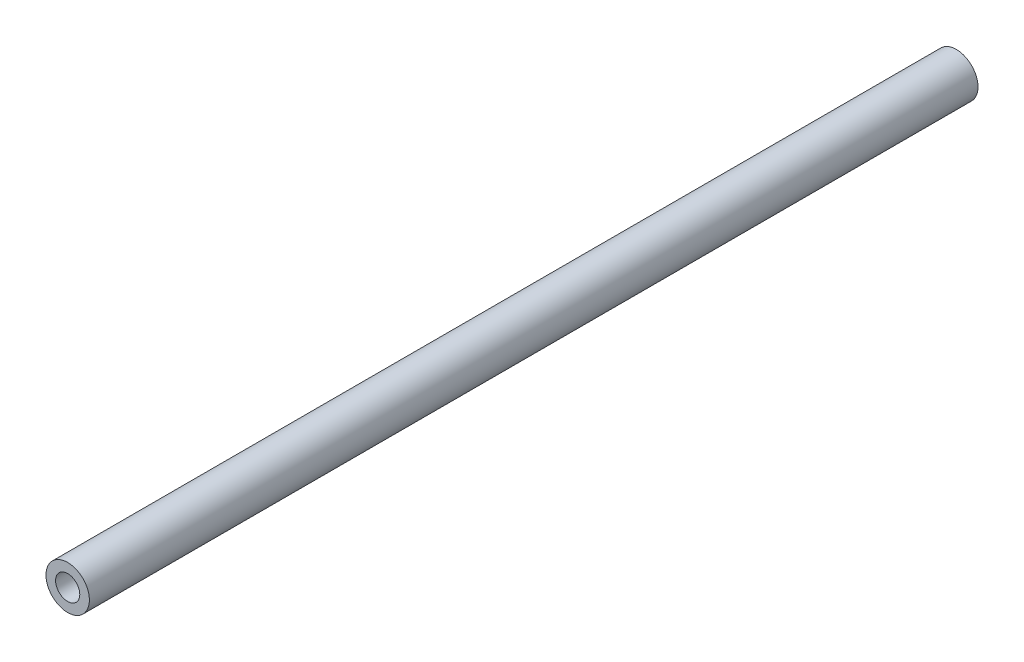
ISO-10303-21;
HEADER;
FILE_DESCRIPTION(('STEP AP214'),'2;1');
FILE_NAME('part.step','',(''),(''),'','','');
FILE_SCHEMA(('AUTOMOTIVE_DESIGN { 1 0 10303 214 1 1 1 1 }'));
ENDSEC;
DATA;
#1=APPLICATION_CONTEXT('core data for automotive mechanical design processes');
#2=APPLICATION_PROTOCOL_DEFINITION('international standard','automotive_design',2000,#1);
#3=PRODUCT_CONTEXT('',#1,'mechanical');
#4=PRODUCT('Part','Part','',(#3));
#5=PRODUCT_RELATED_PRODUCT_CATEGORY('part','',(#4));
#6=PRODUCT_DEFINITION_FORMATION('','',#4);
#7=PRODUCT_DEFINITION_CONTEXT('part definition',#1,'design');
#8=PRODUCT_DEFINITION('design','',#6,#7);
#9=PRODUCT_DEFINITION_SHAPE('','',#8);
#10=(LENGTH_UNIT() NAMED_UNIT(*) SI_UNIT(.MILLI.,.METRE.));
#11=(NAMED_UNIT(*) PLANE_ANGLE_UNIT() SI_UNIT($,.RADIAN.));
#12=(NAMED_UNIT(*) SI_UNIT($,.STERADIAN.) SOLID_ANGLE_UNIT());
#13=UNCERTAINTY_MEASURE_WITH_UNIT(LENGTH_MEASURE(1.E-05),#10,'distance_accuracy_value','');
#14=(GEOMETRIC_REPRESENTATION_CONTEXT(3) GLOBAL_UNCERTAINTY_ASSIGNED_CONTEXT((#13)) GLOBAL_UNIT_ASSIGNED_CONTEXT((#10,
#11,#12)) REPRESENTATION_CONTEXT('',''));
#15=CARTESIAN_POINT('',(0.,0.,0.));
#16=DIRECTION('',(0.,0.,1.));
#17=DIRECTION('',(1.,0.,0.));
#18=AXIS2_PLACEMENT_3D('',#15,#16,#17);
#19=CARTESIAN_POINT('',(0.,0.,350.));
#20=DIRECTION('',(0.,0.,1.));
#21=DIRECTION('',(1.,0.,0.));
#22=AXIS2_PLACEMENT_3D('',#19,#20,#21);
#23=PLANE('',#22);
#24=CARTESIAN_POINT('',(0.,0.,350.));
#25=DIRECTION('',(0.,0.,1.));
#26=DIRECTION('',(1.,0.,0.));
#27=AXIS2_PLACEMENT_3D('',#24,#25,#26);
#28=CIRCLE('',#27,8.55);
#29=CARTESIAN_POINT('',(8.55,0.,350.));
#30=VERTEX_POINT('',#29);
#31=EDGE_CURVE('E10',#30,#30,#28,.T.);
#32=ORIENTED_EDGE('',*,*,#31,.T.);
#33=EDGE_LOOP('',(#32));
#34=FACE_BOUND('',#33,.T.);
#35=CARTESIAN_POINT('',(0.,0.,350.));
#36=DIRECTION('',(0.,0.,1.));
#37=DIRECTION('',(1.,0.,0.));
#38=AXIS2_PLACEMENT_3D('',#35,#36,#37);
#39=CIRCLE('',#38,4.765);
#40=CARTESIAN_POINT('',(4.765,0.,350.));
#41=VERTEX_POINT('',#40);
#42=EDGE_CURVE('E42',#41,#41,#39,.T.);
#43=ORIENTED_EDGE('',*,*,#42,.F.);
#44=EDGE_LOOP('',(#43));
#45=FACE_BOUND('',#44,.T.);
#46=ADVANCED_FACE('F31',(#34,#45),#23,.T.);
#47=CARTESIAN_POINT('',(0.,0.,0.));
#48=DIRECTION('',(0.,0.,1.));
#49=DIRECTION('',(1.,0.,0.));
#50=AXIS2_PLACEMENT_3D('',#47,#48,#49);
#51=PLANE('',#50);
#52=CARTESIAN_POINT('',(0.,0.,0.));
#53=DIRECTION('',(0.,0.,1.));
#54=DIRECTION('',(1.,0.,0.));
#55=AXIS2_PLACEMENT_3D('',#52,#53,#54);
#56=CIRCLE('',#55,8.55);
#57=CARTESIAN_POINT('',(8.55,0.,0.));
#58=VERTEX_POINT('',#57);
#59=EDGE_CURVE('E35',#58,#58,#56,.T.);
#60=ORIENTED_EDGE('',*,*,#59,.F.);
#61=EDGE_LOOP('',(#60));
#62=FACE_BOUND('',#61,.T.);
#63=CARTESIAN_POINT('',(0.,0.,0.));
#64=DIRECTION('',(0.,0.,1.));
#65=DIRECTION('',(1.,0.,0.));
#66=AXIS2_PLACEMENT_3D('',#63,#64,#65);
#67=CIRCLE('',#66,4.765);
#68=CARTESIAN_POINT('',(4.765,0.,0.));
#69=VERTEX_POINT('',#68);
#70=EDGE_CURVE('E44',#69,#69,#67,.T.);
#71=ORIENTED_EDGE('',*,*,#70,.T.);
#72=EDGE_LOOP('',(#71));
#73=FACE_BOUND('',#72,.T.);
#74=ADVANCED_FACE('F54',(#62,#73),#51,.F.);
#75=CARTESIAN_POINT('',(0.,0.,350.));
#76=DIRECTION('',(0.,0.,-1.));
#77=DIRECTION('',(-1.,0.,0.));
#78=AXIS2_PLACEMENT_3D('',#75,#76,#77);
#79=CYLINDRICAL_SURFACE('',#78,8.55);
#80=ORIENTED_EDGE('',*,*,#31,.F.);
#81=EDGE_LOOP('',(#80));
#82=FACE_BOUND('',#81,.T.);
#83=ORIENTED_EDGE('',*,*,#59,.T.);
#84=EDGE_LOOP('',(#83));
#85=FACE_BOUND('',#84,.T.);
#86=ADVANCED_FACE('F33',(#82,#85),#79,.T.);
#87=CARTESIAN_POINT('',(0.,0.,350.));
#88=DIRECTION('',(0.,0.,-1.));
#89=DIRECTION('',(-1.,0.,0.));
#90=AXIS2_PLACEMENT_3D('',#87,#88,#89);
#91=CYLINDRICAL_SURFACE('',#90,4.765);
#92=ORIENTED_EDGE('',*,*,#42,.T.);
#93=EDGE_LOOP('',(#92));
#94=FACE_BOUND('',#93,.T.);
#95=ORIENTED_EDGE('',*,*,#70,.F.);
#96=EDGE_LOOP('',(#95));
#97=FACE_BOUND('',#96,.T.);
#98=ADVANCED_FACE('F50',(#94,#97),#91,.F.);
#99=CLOSED_SHELL('',(#46,#74,#86,#98));
#100=MANIFOLD_SOLID_BREP('B2',#99);
#101=ADVANCED_BREP_SHAPE_REPRESENTATION('',(#18,#100),#14);
#102=SHAPE_DEFINITION_REPRESENTATION(#9,#101);
ENDSEC;
END-ISO-10303-21;
